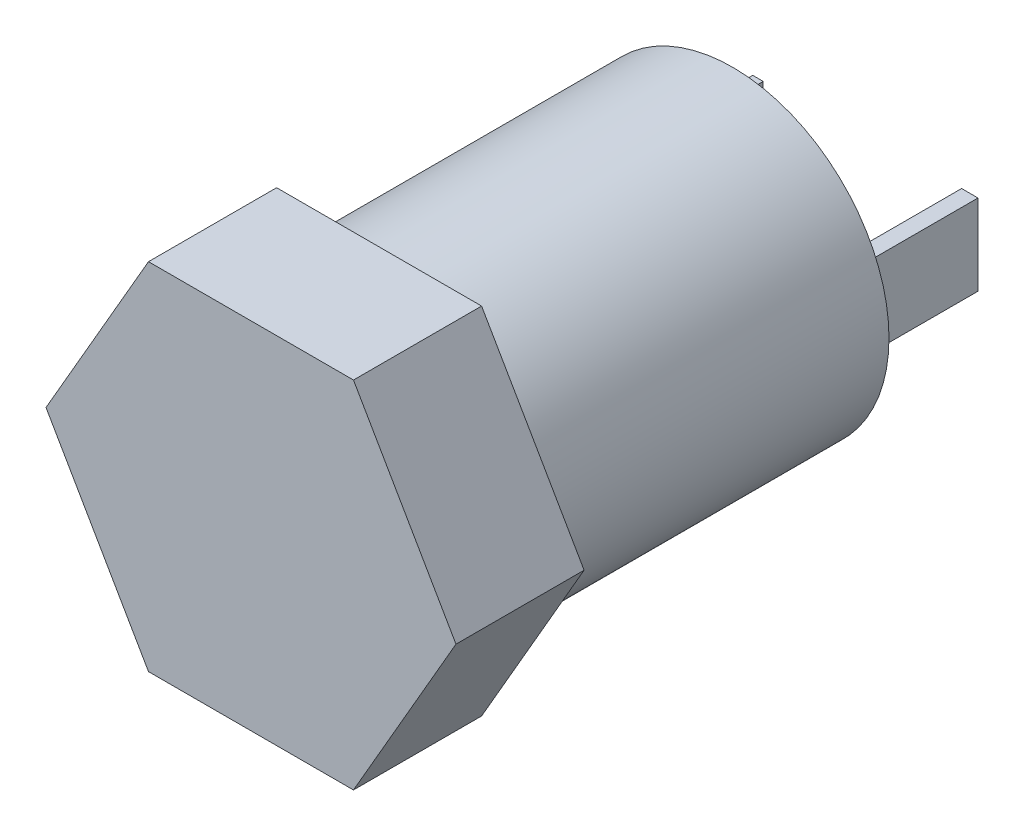
ISO-10303-21;
HEADER;
FILE_DESCRIPTION(('STEP AP214'),'2;1');
FILE_NAME('part.step','',(''),(''),'','','');
FILE_SCHEMA(('AUTOMOTIVE_DESIGN { 1 0 10303 214 1 1 1 1 }'));
ENDSEC;
DATA;
#1=APPLICATION_CONTEXT('core data for automotive mechanical design processes');
#2=APPLICATION_PROTOCOL_DEFINITION('international standard','automotive_design',2000,#1);
#3=PRODUCT_CONTEXT('',#1,'mechanical');
#4=PRODUCT('Part','Part','',(#3));
#5=PRODUCT_RELATED_PRODUCT_CATEGORY('part','',(#4));
#6=PRODUCT_DEFINITION_FORMATION('','',#4);
#7=PRODUCT_DEFINITION_CONTEXT('part definition',#1,'design');
#8=PRODUCT_DEFINITION('design','',#6,#7);
#9=PRODUCT_DEFINITION_SHAPE('','',#8);
#10=(LENGTH_UNIT() NAMED_UNIT(*) SI_UNIT(.MILLI.,.METRE.));
#11=(NAMED_UNIT(*) PLANE_ANGLE_UNIT() SI_UNIT($,.RADIAN.));
#12=(NAMED_UNIT(*) SI_UNIT($,.STERADIAN.) SOLID_ANGLE_UNIT());
#13=UNCERTAINTY_MEASURE_WITH_UNIT(LENGTH_MEASURE(1.E-05),#10,'distance_accuracy_value','');
#14=(GEOMETRIC_REPRESENTATION_CONTEXT(3) GLOBAL_UNCERTAINTY_ASSIGNED_CONTEXT((#13)) GLOBAL_UNIT_ASSIGNED_CONTEXT((#10,
#11,#12)) REPRESENTATION_CONTEXT('',''));
#15=CARTESIAN_POINT('',(0.,0.,0.));
#16=DIRECTION('',(0.,0.,1.));
#17=DIRECTION('',(1.,0.,0.));
#18=AXIS2_PLACEMENT_3D('',#15,#16,#17);
#19=CARTESIAN_POINT('',(0.,0.,-13.8));
#20=DIRECTION('',(0.,0.,-1.));
#21=DIRECTION('',(-1.,0.,0.));
#22=AXIS2_PLACEMENT_3D('',#19,#20,#21);
#23=PLANE('',#22);
#24=CARTESIAN_POINT('',(0.,0.,-13.8));
#25=DIRECTION('',(0.,0.,-1.));
#26=DIRECTION('',(-1.,0.,0.));
#27=AXIS2_PLACEMENT_3D('',#24,#25,#26);
#28=CIRCLE('',#27,6.1);
#29=CARTESIAN_POINT('',(6.1,0.,-13.8));
#30=VERTEX_POINT('',#29);
#31=EDGE_CURVE('E169',#30,#30,#28,.T.);
#32=ORIENTED_EDGE('',*,*,#31,.T.);
#33=EDGE_LOOP('',(#32));
#34=FACE_BOUND('',#33,.T.);
#35=DIRECTION('',(-1.,0.,0.));
#36=VECTOR('',#35,1.);
#37=CARTESIAN_POINT('',(-4.00811270965175,-1.88415554727215,-13.8));
#38=LINE('',#37,#36);
#39=CARTESIAN_POINT('',(-4.00811270965175,-1.88415554727215,-13.8));
#40=VERTEX_POINT('',#39);
#41=CARTESIAN_POINT('',(-4.41920119269296,-1.88415554727215,-13.8));
#42=VERTEX_POINT('',#41);
#43=EDGE_CURVE('E192',#40,#42,#38,.T.);
#44=ORIENTED_EDGE('',*,*,#43,.F.);
#45=DIRECTION('',(0.,-1.,0.));
#46=VECTOR('',#45,1.);
#47=CARTESIAN_POINT('',(-4.00811270965175,1.01630208307413,-13.8));
#48=LINE('',#47,#46);
#49=CARTESIAN_POINT('',(-4.00811270965175,1.01630208307413,-13.8));
#50=VERTEX_POINT('',#49);
#51=EDGE_CURVE('E194',#50,#40,#48,.T.);
#52=ORIENTED_EDGE('',*,*,#51,.F.);
#53=DIRECTION('',(1.,0.,0.));
#54=VECTOR('',#53,1.);
#55=CARTESIAN_POINT('',(-4.00811270965175,1.01630208307413,-13.8));
#56=LINE('',#55,#54);
#57=CARTESIAN_POINT('',(-4.41920119269296,1.01630208307413,-13.8));
#58=VERTEX_POINT('',#57);
#59=EDGE_CURVE('E187',#58,#50,#56,.T.);
#60=ORIENTED_EDGE('',*,*,#59,.F.);
#61=DIRECTION('',(0.,1.,0.));
#62=VECTOR('',#61,1.);
#63=CARTESIAN_POINT('',(-4.41920119269296,1.01630208307413,-13.8));
#64=LINE('',#63,#62);
#65=EDGE_CURVE('E189',#42,#58,#64,.T.);
#66=ORIENTED_EDGE('',*,*,#65,.F.);
#67=EDGE_LOOP('',(#44,#52,#60,#66));
#68=FACE_BOUND('',#67,.T.);
#69=DIRECTION('',(-1.,0.,0.));
#70=VECTOR('',#69,1.);
#71=CARTESIAN_POINT('',(4.37352469457727,-1.88415554727215,-13.8));
#72=LINE('',#71,#70);
#73=CARTESIAN_POINT('',(4.37352469457727,-1.88415554727215,-13.8));
#74=VERTEX_POINT('',#73);
#75=CARTESIAN_POINT('',(3.73405372095762,-1.88415554727215,-13.8));
#76=VERTEX_POINT('',#75);
#77=EDGE_CURVE('E416',#74,#76,#72,.T.);
#78=ORIENTED_EDGE('',*,*,#77,.F.);
#79=DIRECTION('',(0.,-1.,0.));
#80=VECTOR('',#79,1.);
#81=CARTESIAN_POINT('',(4.37352469457727,1.26752282271043,-13.8));
#82=LINE('',#81,#80);
#83=CARTESIAN_POINT('',(4.37352469457727,1.26752282271043,-13.8));
#84=VERTEX_POINT('',#83);
#85=EDGE_CURVE('E167',#84,#74,#82,.T.);
#86=ORIENTED_EDGE('',*,*,#85,.F.);
#87=DIRECTION('',(1.,0.,0.));
#88=VECTOR('',#87,1.);
#89=CARTESIAN_POINT('',(4.37352469457727,1.26752282271043,-13.8));
#90=LINE('',#89,#88);
#91=CARTESIAN_POINT('',(3.73405372095762,1.26752282271043,-13.8));
#92=VERTEX_POINT('',#91);
#93=EDGE_CURVE('E163',#92,#84,#90,.T.);
#94=ORIENTED_EDGE('',*,*,#93,.F.);
#95=DIRECTION('',(0.,1.,0.));
#96=VECTOR('',#95,1.);
#97=CARTESIAN_POINT('',(3.73405372095762,1.26752282271043,-13.8));
#98=LINE('',#97,#96);
#99=EDGE_CURVE('E413',#76,#92,#98,.T.);
#100=ORIENTED_EDGE('',*,*,#99,.F.);
#101=EDGE_LOOP('',(#78,#86,#94,#100));
#102=FACE_BOUND('',#101,.T.);
#103=ADVANCED_FACE('F41',(#34,#68,#102),#23,.T.);
#104=CARTESIAN_POINT('',(4.00000000000008,-6.92820323027546,5.));
#105=DIRECTION('',(-0.866025403784442,0.499999999999995,0.));
#106=DIRECTION('',(-0.499999999999995,-0.866025403784442,0.));
#107=AXIS2_PLACEMENT_3D('',#104,#105,#106);
#108=PLANE('',#107);
#109=DIRECTION('',(0.499999999999995,0.866025403784441,0.));
#110=VECTOR('',#109,1.);
#111=CARTESIAN_POINT('',(4.00000000000008,-6.92820323027546,0.));
#112=LINE('',#111,#110);
#113=CARTESIAN_POINT('',(4.00000000000008,-6.92820323027546,0.));
#114=VERTEX_POINT('',#113);
#115=CARTESIAN_POINT('',(8.,0.,0.));
#116=VERTEX_POINT('',#115);
#117=EDGE_CURVE('E172',#114,#116,#112,.T.);
#118=ORIENTED_EDGE('',*,*,#117,.T.);
#119=DIRECTION('',(0.,0.,-1.));
#120=VECTOR('',#119,1.);
#121=CARTESIAN_POINT('',(8.,0.,5.));
#122=LINE('',#121,#120);
#123=CARTESIAN_POINT('',(8.,0.,5.));
#124=VERTEX_POINT('',#123);
#125=EDGE_CURVE('E45',#124,#116,#122,.T.);
#126=ORIENTED_EDGE('',*,*,#125,.F.);
#127=DIRECTION('',(0.499999999999995,0.866025403784441,0.));
#128=VECTOR('',#127,1.);
#129=CARTESIAN_POINT('',(4.00000000000008,-6.92820323027546,5.));
#130=LINE('',#129,#128);
#131=CARTESIAN_POINT('',(4.00000000000008,-6.92820323027546,5.));
#132=VERTEX_POINT('',#131);
#133=EDGE_CURVE('E204',#132,#124,#130,.T.);
#134=ORIENTED_EDGE('',*,*,#133,.F.);
#135=DIRECTION('',(0.,0.,-1.));
#136=VECTOR('',#135,1.);
#137=CARTESIAN_POINT('',(4.00000000000008,-6.92820323027546,5.));
#138=LINE('',#137,#136);
#139=EDGE_CURVE('E218',#132,#114,#138,.T.);
#140=ORIENTED_EDGE('',*,*,#139,.T.);
#141=EDGE_LOOP('',(#118,#126,#134,#140));
#142=FACE_BOUND('',#141,.T.);
#143=ADVANCED_FACE('F43',(#142),#108,.F.);
#144=CARTESIAN_POINT('',(8.,0.,5.));
#145=DIRECTION('',(-0.866025403784438,-0.500000000000001,0.));
#146=DIRECTION('',(0.500000000000001,-0.866025403784438,0.));
#147=AXIS2_PLACEMENT_3D('',#144,#145,#146);
#148=PLANE('',#147);
#149=DIRECTION('',(-0.500000000000001,0.866025403784438,0.));
#150=VECTOR('',#149,1.);
#151=CARTESIAN_POINT('',(8.,0.,0.));
#152=LINE('',#151,#150);
#153=CARTESIAN_POINT('',(3.99999999999998,6.92820323027552,0.));
#154=VERTEX_POINT('',#153);
#155=EDGE_CURVE('E221',#116,#154,#152,.T.);
#156=ORIENTED_EDGE('',*,*,#155,.T.);
#157=DIRECTION('',(0.,0.,-1.));
#158=VECTOR('',#157,1.);
#159=CARTESIAN_POINT('',(3.99999999999998,6.92820323027552,5.));
#160=LINE('',#159,#158);
#161=CARTESIAN_POINT('',(3.99999999999998,6.92820323027552,5.));
#162=VERTEX_POINT('',#161);
#163=EDGE_CURVE('E240',#162,#154,#160,.T.);
#164=ORIENTED_EDGE('',*,*,#163,.F.);
#165=DIRECTION('',(-0.500000000000001,0.866025403784438,0.));
#166=VECTOR('',#165,1.);
#167=CARTESIAN_POINT('',(8.,0.,5.));
#168=LINE('',#167,#166);
#169=EDGE_CURVE('E207',#124,#162,#168,.T.);
#170=ORIENTED_EDGE('',*,*,#169,.F.);
#171=ORIENTED_EDGE('',*,*,#125,.T.);
#172=EDGE_LOOP('',(#156,#164,#170,#171));
#173=FACE_BOUND('',#172,.T.);
#174=ADVANCED_FACE('F249',(#173),#148,.F.);
#175=CARTESIAN_POINT('',(3.99999999999998,6.92820323027552,5.));
#176=DIRECTION('',(0.,-1.,0.));
#177=DIRECTION('',(1.,0.,0.));
#178=AXIS2_PLACEMENT_3D('',#175,#176,#177);
#179=PLANE('',#178);
#180=DIRECTION('',(-1.,0.,0.));
#181=VECTOR('',#180,1.);
#182=CARTESIAN_POINT('',(3.99999999999998,6.92820323027552,0.));
#183=LINE('',#182,#181);
#184=CARTESIAN_POINT('',(-4.00000000000003,6.92820323027549,0.));
#185=VERTEX_POINT('',#184);
#186=EDGE_CURVE('E223',#154,#185,#183,.T.);
#187=ORIENTED_EDGE('',*,*,#186,.T.);
#188=DIRECTION('',(0.,0.,-1.));
#189=VECTOR('',#188,1.);
#190=CARTESIAN_POINT('',(-4.00000000000003,6.92820323027549,5.));
#191=LINE('',#190,#189);
#192=CARTESIAN_POINT('',(-4.00000000000003,6.92820323027549,5.));
#193=VERTEX_POINT('',#192);
#194=EDGE_CURVE('E238',#193,#185,#191,.T.);
#195=ORIENTED_EDGE('',*,*,#194,.F.);
#196=DIRECTION('',(-1.,0.,0.));
#197=VECTOR('',#196,1.);
#198=CARTESIAN_POINT('',(3.99999999999998,6.92820323027552,5.));
#199=LINE('',#198,#197);
#200=EDGE_CURVE('E210',#162,#193,#199,.T.);
#201=ORIENTED_EDGE('',*,*,#200,.F.);
#202=ORIENTED_EDGE('',*,*,#163,.T.);
#203=EDGE_LOOP('',(#187,#195,#201,#202));
#204=FACE_BOUND('',#203,.T.);
#205=ADVANCED_FACE('F260',(#204),#179,.F.);
#206=CARTESIAN_POINT('',(-4.00000000000003,6.92820323027549,5.));
#207=DIRECTION('',(0.866025403784442,-0.499999999999995,0.));
#208=DIRECTION('',(0.499999999999995,0.866025403784442,0.));
#209=AXIS2_PLACEMENT_3D('',#206,#207,#208);
#210=PLANE('',#209);
#211=DIRECTION('',(-0.499999999999995,-0.866025403784442,0.));
#212=VECTOR('',#211,1.);
#213=CARTESIAN_POINT('',(-4.00000000000003,6.92820323027549,0.));
#214=LINE('',#213,#212);
#215=CARTESIAN_POINT('',(-8.,0.,0.));
#216=VERTEX_POINT('',#215);
#217=EDGE_CURVE('E225',#185,#216,#214,.T.);
#218=ORIENTED_EDGE('',*,*,#217,.T.);
#219=DIRECTION('',(0.,0.,-1.));
#220=VECTOR('',#219,1.);
#221=CARTESIAN_POINT('',(-8.,0.,5.));
#222=LINE('',#221,#220);
#223=CARTESIAN_POINT('',(-8.,0.,5.));
#224=VERTEX_POINT('',#223);
#225=EDGE_CURVE('E235',#224,#216,#222,.T.);
#226=ORIENTED_EDGE('',*,*,#225,.F.);
#227=DIRECTION('',(-0.499999999999995,-0.866025403784442,0.));
#228=VECTOR('',#227,1.);
#229=CARTESIAN_POINT('',(-4.00000000000003,6.92820323027549,5.));
#230=LINE('',#229,#228);
#231=EDGE_CURVE('E212',#193,#224,#230,.T.);
#232=ORIENTED_EDGE('',*,*,#231,.F.);
#233=ORIENTED_EDGE('',*,*,#194,.T.);
#234=EDGE_LOOP('',(#218,#226,#232,#233));
#235=FACE_BOUND('',#234,.T.);
#236=ADVANCED_FACE('F263',(#235),#210,.F.);
#237=CARTESIAN_POINT('',(-8.,0.,5.));
#238=DIRECTION('',(0.866025403784434,0.500000000000007,0.));
#239=DIRECTION('',(-0.500000000000007,0.866025403784435,0.));
#240=AXIS2_PLACEMENT_3D('',#237,#238,#239);
#241=PLANE('',#240);
#242=DIRECTION('',(0.500000000000007,-0.866025403784435,0.));
#243=VECTOR('',#242,1.);
#244=CARTESIAN_POINT('',(-8.,0.,0.));
#245=LINE('',#244,#243);
#246=CARTESIAN_POINT('',(-3.99999999999994,-6.92820323027555,0.));
#247=VERTEX_POINT('',#246);
#248=EDGE_CURVE('E227',#216,#247,#245,.T.);
#249=ORIENTED_EDGE('',*,*,#248,.T.);
#250=DIRECTION('',(0.,0.,-1.));
#251=VECTOR('',#250,1.);
#252=CARTESIAN_POINT('',(-3.99999999999994,-6.92820323027555,5.));
#253=LINE('',#252,#251);
#254=CARTESIAN_POINT('',(-3.99999999999994,-6.92820323027555,5.));
#255=VERTEX_POINT('',#254);
#256=EDGE_CURVE('E232',#255,#247,#253,.T.);
#257=ORIENTED_EDGE('',*,*,#256,.F.);
#258=DIRECTION('',(0.500000000000007,-0.866025403784435,0.));
#259=VECTOR('',#258,1.);
#260=CARTESIAN_POINT('',(-8.,0.,5.));
#261=LINE('',#260,#259);
#262=EDGE_CURVE('E214',#224,#255,#261,.T.);
#263=ORIENTED_EDGE('',*,*,#262,.F.);
#264=ORIENTED_EDGE('',*,*,#225,.T.);
#265=EDGE_LOOP('',(#249,#257,#263,#264));
#266=FACE_BOUND('',#265,.T.);
#267=ADVANCED_FACE('F273',(#266),#241,.F.);
#268=CARTESIAN_POINT('',(-3.99999999999994,-6.92820323027555,5.));
#269=DIRECTION('',(0.,1.,0.));
#270=DIRECTION('',(-1.,0.,0.));
#271=AXIS2_PLACEMENT_3D('',#268,#269,#270);
#272=PLANE('',#271);
#273=DIRECTION('',(1.,0.,0.));
#274=VECTOR('',#273,1.);
#275=CARTESIAN_POINT('',(-3.99999999999994,-6.92820323027555,0.));
#276=LINE('',#275,#274);
#277=EDGE_CURVE('E208',#247,#114,#276,.T.);
#278=ORIENTED_EDGE('',*,*,#277,.T.);
#279=ORIENTED_EDGE('',*,*,#139,.F.);
#280=DIRECTION('',(1.,0.,0.));
#281=VECTOR('',#280,1.);
#282=CARTESIAN_POINT('',(-3.99999999999994,-6.92820323027555,5.));
#283=LINE('',#282,#281);
#284=EDGE_CURVE('E216',#255,#132,#283,.T.);
#285=ORIENTED_EDGE('',*,*,#284,.F.);
#286=ORIENTED_EDGE('',*,*,#256,.T.);
#287=EDGE_LOOP('',(#278,#279,#285,#286));
#288=FACE_BOUND('',#287,.T.);
#289=ADVANCED_FACE('F271',(#288),#272,.F.);
#290=CARTESIAN_POINT('',(0.,0.,5.));
#291=DIRECTION('',(0.,0.,1.));
#292=DIRECTION('',(1.,0.,0.));
#293=AXIS2_PLACEMENT_3D('',#290,#291,#292);
#294=PLANE('',#293);
#295=ORIENTED_EDGE('',*,*,#133,.T.);
#296=ORIENTED_EDGE('',*,*,#169,.T.);
#297=ORIENTED_EDGE('',*,*,#200,.T.);
#298=ORIENTED_EDGE('',*,*,#231,.T.);
#299=ORIENTED_EDGE('',*,*,#262,.T.);
#300=ORIENTED_EDGE('',*,*,#284,.T.);
#301=EDGE_LOOP('',(#295,#296,#297,#298,#299,#300));
#302=FACE_BOUND('',#301,.T.);
#303=ADVANCED_FACE('F267',(#302),#294,.T.);
#304=CARTESIAN_POINT('',(0.,0.,0.));
#305=DIRECTION('',(0.,0.,1.));
#306=DIRECTION('',(1.,0.,0.));
#307=AXIS2_PLACEMENT_3D('',#304,#305,#306);
#308=PLANE('',#307);
#309=CARTESIAN_POINT('',(0.,0.,0.));
#310=DIRECTION('',(0.,0.,-1.));
#311=DIRECTION('',(-1.,0.,0.));
#312=AXIS2_PLACEMENT_3D('',#309,#310,#311);
#313=CIRCLE('',#312,6.1);
#314=CARTESIAN_POINT('',(6.1,0.,0.));
#315=VERTEX_POINT('',#314);
#316=EDGE_CURVE('E11',#315,#315,#313,.T.);
#317=ORIENTED_EDGE('',*,*,#316,.F.);
#318=EDGE_LOOP('',(#317));
#319=FACE_BOUND('',#318,.T.);
#320=ORIENTED_EDGE('',*,*,#117,.F.);
#321=ORIENTED_EDGE('',*,*,#277,.F.);
#322=ORIENTED_EDGE('',*,*,#248,.F.);
#323=ORIENTED_EDGE('',*,*,#217,.F.);
#324=ORIENTED_EDGE('',*,*,#186,.F.);
#325=ORIENTED_EDGE('',*,*,#155,.F.);
#326=EDGE_LOOP('',(#320,#321,#322,#323,#324,#325));
#327=FACE_BOUND('',#326,.T.);
#328=ADVANCED_FACE('F256',(#319,#327),#308,.F.);
#329=CARTESIAN_POINT('',(0.,0.,-13.8));
#330=DIRECTION('',(0.,0.,1.));
#331=DIRECTION('',(1.,0.,0.));
#332=AXIS2_PLACEMENT_3D('',#329,#330,#331);
#333=CYLINDRICAL_SURFACE('',#332,6.1);
#334=CARTESIAN_POINT('',(6.1,0.,-13.8));
#335=CARTESIAN_POINT('',(6.1,0.,-13.65625));
#336=CARTESIAN_POINT('',(6.1,0.,-13.5125));
#337=CARTESIAN_POINT('',(6.1,0.,-13.225));
#338=CARTESIAN_POINT('',(6.1,0.,-13.08125));
#339=CARTESIAN_POINT('',(6.1,0.,-12.79375));
#340=CARTESIAN_POINT('',(6.1,0.,-12.65));
#341=CARTESIAN_POINT('',(6.1,0.,-12.3625));
#342=CARTESIAN_POINT('',(6.1,0.,-12.21875));
#343=CARTESIAN_POINT('',(6.1,0.,-11.93125));
#344=CARTESIAN_POINT('',(6.1,0.,-11.7875));
#345=CARTESIAN_POINT('',(6.1,0.,-11.5));
#346=CARTESIAN_POINT('',(6.1,0.,-11.35625));
#347=CARTESIAN_POINT('',(6.1,0.,-11.06875));
#348=CARTESIAN_POINT('',(6.1,0.,-10.925));
#349=CARTESIAN_POINT('',(6.1,0.,-10.6375));
#350=CARTESIAN_POINT('',(6.1,0.,-10.49375));
#351=CARTESIAN_POINT('',(6.1,0.,-10.20625));
#352=CARTESIAN_POINT('',(6.1,0.,-10.0625));
#353=CARTESIAN_POINT('',(6.1,0.,-9.775));
#354=CARTESIAN_POINT('',(6.1,0.,-9.63125));
#355=CARTESIAN_POINT('',(6.1,0.,-9.34375));
#356=CARTESIAN_POINT('',(6.1,0.,-9.2));
#357=CARTESIAN_POINT('',(6.1,0.,-8.9125));
#358=CARTESIAN_POINT('',(6.1,0.,-8.76875));
#359=CARTESIAN_POINT('',(6.1,0.,-8.48125));
#360=CARTESIAN_POINT('',(6.1,0.,-8.3375));
#361=CARTESIAN_POINT('',(6.1,0.,-8.05));
#362=CARTESIAN_POINT('',(6.1,0.,-7.90625));
#363=CARTESIAN_POINT('',(6.1,0.,-7.61875));
#364=CARTESIAN_POINT('',(6.1,0.,-7.475));
#365=CARTESIAN_POINT('',(6.1,0.,-7.1875));
#366=CARTESIAN_POINT('',(6.1,0.,-7.04375));
#367=CARTESIAN_POINT('',(6.1,0.,-6.75625));
#368=CARTESIAN_POINT('',(6.1,0.,-6.6125));
#369=CARTESIAN_POINT('',(6.1,0.,-6.325));
#370=CARTESIAN_POINT('',(6.1,0.,-6.18125));
#371=CARTESIAN_POINT('',(6.1,0.,-5.89375));
#372=CARTESIAN_POINT('',(6.1,0.,-5.75));
#373=CARTESIAN_POINT('',(6.1,0.,-5.4625));
#374=CARTESIAN_POINT('',(6.1,0.,-5.31875));
#375=CARTESIAN_POINT('',(6.1,0.,-5.03125));
#376=CARTESIAN_POINT('',(6.1,0.,-4.8875));
#377=CARTESIAN_POINT('',(6.1,0.,-4.6));
#378=CARTESIAN_POINT('',(6.1,0.,-4.45625));
#379=CARTESIAN_POINT('',(6.1,0.,-4.16875));
#380=CARTESIAN_POINT('',(6.1,0.,-4.025));
#381=CARTESIAN_POINT('',(6.1,0.,-3.7375));
#382=CARTESIAN_POINT('',(6.1,0.,-3.59375));
#383=CARTESIAN_POINT('',(6.1,0.,-3.30625));
#384=CARTESIAN_POINT('',(6.1,0.,-3.1625));
#385=CARTESIAN_POINT('',(6.1,0.,-2.875));
#386=CARTESIAN_POINT('',(6.1,0.,-2.73125));
#387=CARTESIAN_POINT('',(6.1,0.,-2.44375));
#388=CARTESIAN_POINT('',(6.1,0.,-2.3));
#389=CARTESIAN_POINT('',(6.1,0.,-2.0125));
#390=CARTESIAN_POINT('',(6.1,0.,-1.86875));
#391=CARTESIAN_POINT('',(6.1,0.,-1.58125));
#392=CARTESIAN_POINT('',(6.1,0.,-1.4375));
#393=CARTESIAN_POINT('',(6.1,0.,-1.15));
#394=CARTESIAN_POINT('',(6.1,0.,-1.00625));
#395=CARTESIAN_POINT('',(6.1,0.,-0.71875));
#396=CARTESIAN_POINT('',(6.1,0.,-0.575));
#397=CARTESIAN_POINT('',(6.1,0.,-0.2875));
#398=CARTESIAN_POINT('',(6.1,0.,-0.14375));
#399=CARTESIAN_POINT('',(6.1,0.,0.));
#400=B_SPLINE_CURVE_WITH_KNOTS('',3,(#334,#335,#336,#337,#338,#339,#340,#341,#342,#343,#344,
#345,#346,#347,#348,#349,#350,#351,#352,#353,#354,#355,#356,#357,#358,#359,#360,#361,#362,#363,
#364,#365,#366,#367,#368,#369,#370,#371,#372,#373,#374,#375,#376,#377,#378,#379,#380,#381,#382,
#383,#384,#385,#386,#387,#388,#389,#390,#391,#392,#393,#394,#395,#396,#397,#398,#399),
.UNSPECIFIED.,.F.,.F.,(4,2,2,2,2,2,2,2,2,2,2,2,2,2,2,2,2,2,2,2,2,2,2,2,2,2,2,2,2,2,2,2,4),(0.,
0.431249999999999,0.862499999999999,1.29375,1.725,2.15625,2.5875,3.01875,3.45,3.88125,4.3125,
4.74375,5.175,5.60625,6.0375,6.46875,6.9,7.33125,7.7625,8.19375,8.625,9.05625,9.4875,9.91875,
10.35,10.78125,11.2125,11.64375,12.075,12.50625,12.9375,13.36875,13.8),.UNSPECIFIED.);
#401=EDGE_CURVE('BSEAM295',#30,#315,#400,.T.);
#402=ORIENTED_EDGE('',*,*,#31,.F.);
#403=ORIENTED_EDGE('',*,*,#316,.T.);
#404=ORIENTED_EDGE('',*,*,#401,.T.);
#405=ORIENTED_EDGE('',*,*,#401,.F.);
#406=EDGE_LOOP('',(#402,#404,#403,#405));
#407=FACE_BOUND('',#406,.T.);
#408=ADVANCED_FACE('F295',(#407),#333,.T.);
#409=CARTESIAN_POINT('',(-4.00811270965175,1.01630208307413,-19.));
#410=DIRECTION('',(-1.,0.,0.));
#411=DIRECTION('',(0.,0.,1.));
#412=AXIS2_PLACEMENT_3D('',#409,#410,#411);
#413=PLANE('',#412);
#414=ORIENTED_EDGE('',*,*,#51,.T.);
#415=DIRECTION('',(0.,0.,1.));
#416=VECTOR('',#415,1.);
#417=CARTESIAN_POINT('',(-4.00811270965175,-1.88415554727215,-19.));
#418=LINE('',#417,#416);
#419=CARTESIAN_POINT('',(-4.00811270965175,-1.88415554727215,-19.));
#420=VERTEX_POINT('',#419);
#421=EDGE_CURVE('E177',#420,#40,#418,.T.);
#422=ORIENTED_EDGE('',*,*,#421,.F.);
#423=DIRECTION('',(0.,-1.,0.));
#424=VECTOR('',#423,1.);
#425=CARTESIAN_POINT('',(-4.00811270965175,1.01630208307413,-19.));
#426=LINE('',#425,#424);
#427=CARTESIAN_POINT('',(-4.00811270965175,1.01630208307413,-19.));
#428=VERTEX_POINT('',#427);
#429=EDGE_CURVE('E190',#428,#420,#426,.T.);
#430=ORIENTED_EDGE('',*,*,#429,.F.);
#431=DIRECTION('',(0.,0.,1.));
#432=VECTOR('',#431,1.);
#433=CARTESIAN_POINT('',(-4.00811270965175,1.01630208307413,-19.));
#434=LINE('',#433,#432);
#435=EDGE_CURVE('E183',#428,#50,#434,.T.);
#436=ORIENTED_EDGE('',*,*,#435,.T.);
#437=EDGE_LOOP('',(#414,#422,#430,#436));
#438=FACE_BOUND('',#437,.T.);
#439=ADVANCED_FACE('F297',(#438),#413,.F.);
#440=CARTESIAN_POINT('',(-4.00811270965175,-1.88415554727215,-19.));
#441=DIRECTION('',(0.,1.,0.));
#442=DIRECTION('',(0.,0.,1.));
#443=AXIS2_PLACEMENT_3D('',#440,#441,#442);
#444=PLANE('',#443);
#445=ORIENTED_EDGE('',*,*,#43,.T.);
#446=DIRECTION('',(0.,0.,1.));
#447=VECTOR('',#446,1.);
#448=CARTESIAN_POINT('',(-4.41920119269296,-1.88415554727215,-19.));
#449=LINE('',#448,#447);
#450=CARTESIAN_POINT('',(-4.41920119269296,-1.88415554727215,-19.));
#451=VERTEX_POINT('',#450);
#452=EDGE_CURVE('E179',#451,#42,#449,.T.);
#453=ORIENTED_EDGE('',*,*,#452,.F.);
#454=DIRECTION('',(-1.,0.,0.));
#455=VECTOR('',#454,1.);
#456=CARTESIAN_POINT('',(-4.00811270965175,-1.88415554727215,-19.));
#457=LINE('',#456,#455);
#458=EDGE_CURVE('E200',#420,#451,#457,.T.);
#459=ORIENTED_EDGE('',*,*,#458,.F.);
#460=ORIENTED_EDGE('',*,*,#421,.T.);
#461=EDGE_LOOP('',(#445,#453,#459,#460));
#462=FACE_BOUND('',#461,.T.);
#463=ADVANCED_FACE('F327',(#462),#444,.F.);
#464=CARTESIAN_POINT('',(-4.41920119269296,1.01630208307413,-19.));
#465=DIRECTION('',(1.,0.,0.));
#466=DIRECTION('',(0.,0.,-1.));
#467=AXIS2_PLACEMENT_3D('',#464,#465,#466);
#468=PLANE('',#467);
#469=ORIENTED_EDGE('',*,*,#65,.T.);
#470=DIRECTION('',(0.,0.,1.));
#471=VECTOR('',#470,1.);
#472=CARTESIAN_POINT('',(-4.41920119269296,1.01630208307413,-19.));
#473=LINE('',#472,#471);
#474=CARTESIAN_POINT('',(-4.41920119269296,1.01630208307413,-19.));
#475=VERTEX_POINT('',#474);
#476=EDGE_CURVE('E65',#475,#58,#473,.T.);
#477=ORIENTED_EDGE('',*,*,#476,.F.);
#478=DIRECTION('',(0.,1.,0.));
#479=VECTOR('',#478,1.);
#480=CARTESIAN_POINT('',(-4.41920119269296,1.01630208307413,-19.));
#481=LINE('',#480,#479);
#482=EDGE_CURVE('E198',#451,#475,#481,.T.);
#483=ORIENTED_EDGE('',*,*,#482,.F.);
#484=ORIENTED_EDGE('',*,*,#452,.T.);
#485=EDGE_LOOP('',(#469,#477,#483,#484));
#486=FACE_BOUND('',#485,.T.);
#487=ADVANCED_FACE('F337',(#486),#468,.F.);
#488=CARTESIAN_POINT('',(-4.00811270965175,1.01630208307413,-19.));
#489=DIRECTION('',(0.,-1.,0.));
#490=DIRECTION('',(0.,0.,-1.));
#491=AXIS2_PLACEMENT_3D('',#488,#489,#490);
#492=PLANE('',#491);
#493=ORIENTED_EDGE('',*,*,#59,.T.);
#494=ORIENTED_EDGE('',*,*,#435,.F.);
#495=DIRECTION('',(1.,0.,0.));
#496=VECTOR('',#495,1.);
#497=CARTESIAN_POINT('',(-4.00811270965175,1.01630208307413,-19.));
#498=LINE('',#497,#496);
#499=EDGE_CURVE('E186',#475,#428,#498,.T.);
#500=ORIENTED_EDGE('',*,*,#499,.F.);
#501=ORIENTED_EDGE('',*,*,#476,.T.);
#502=EDGE_LOOP('',(#493,#494,#500,#501));
#503=FACE_BOUND('',#502,.T.);
#504=ADVANCED_FACE('F347',(#503),#492,.F.);
#505=CARTESIAN_POINT('',(0.,0.,-19.));
#506=DIRECTION('',(0.,0.,-1.));
#507=DIRECTION('',(-1.,0.,0.));
#508=AXIS2_PLACEMENT_3D('',#505,#506,#507);
#509=PLANE('',#508);
#510=ORIENTED_EDGE('',*,*,#429,.T.);
#511=ORIENTED_EDGE('',*,*,#458,.T.);
#512=ORIENTED_EDGE('',*,*,#482,.T.);
#513=ORIENTED_EDGE('',*,*,#499,.T.);
#514=EDGE_LOOP('',(#510,#511,#512,#513));
#515=FACE_BOUND('',#514,.T.);
#516=ADVANCED_FACE('F293',(#515),#509,.T.);
#517=CARTESIAN_POINT('',(4.37352469457727,1.26752282271043,-19.));
#518=DIRECTION('',(-1.,0.,0.));
#519=DIRECTION('',(0.,0.,1.));
#520=AXIS2_PLACEMENT_3D('',#517,#518,#519);
#521=PLANE('',#520);
#522=ORIENTED_EDGE('',*,*,#85,.T.);
#523=DIRECTION('',(0.,0.,1.));
#524=VECTOR('',#523,1.);
#525=CARTESIAN_POINT('',(4.37352469457727,-1.88415554727215,-19.));
#526=LINE('',#525,#524);
#527=CARTESIAN_POINT('',(4.37352469457727,-1.88415554727215,-19.));
#528=VERTEX_POINT('',#527);
#529=EDGE_CURVE('E148',#528,#74,#526,.T.);
#530=ORIENTED_EDGE('',*,*,#529,.F.);
#531=DIRECTION('',(0.,-1.,0.));
#532=VECTOR('',#531,1.);
#533=CARTESIAN_POINT('',(4.37352469457727,1.26752282271043,-19.));
#534=LINE('',#533,#532);
#535=CARTESIAN_POINT('',(4.37352469457727,1.26752282271043,-19.));
#536=VERTEX_POINT('',#535);
#537=EDGE_CURVE('E155',#536,#528,#534,.T.);
#538=ORIENTED_EDGE('',*,*,#537,.F.);
#539=DIRECTION('',(0.,0.,1.));
#540=VECTOR('',#539,1.);
#541=CARTESIAN_POINT('',(4.37352469457727,1.26752282271043,-19.));
#542=LINE('',#541,#540);
#543=EDGE_CURVE('E410',#536,#84,#542,.T.);
#544=ORIENTED_EDGE('',*,*,#543,.T.);
#545=EDGE_LOOP('',(#522,#530,#538,#544));
#546=FACE_BOUND('',#545,.T.);
#547=ADVANCED_FACE('F165',(#546),#521,.F.);
#548=CARTESIAN_POINT('',(4.37352469457727,-1.88415554727215,-19.));
#549=DIRECTION('',(0.,1.,0.));
#550=DIRECTION('',(0.,0.,1.));
#551=AXIS2_PLACEMENT_3D('',#548,#549,#550);
#552=PLANE('',#551);
#553=ORIENTED_EDGE('',*,*,#77,.T.);
#554=DIRECTION('',(0.,0.,1.));
#555=VECTOR('',#554,1.);
#556=CARTESIAN_POINT('',(3.73405372095762,-1.88415554727215,-19.));
#557=LINE('',#556,#555);
#558=CARTESIAN_POINT('',(3.73405372095762,-1.88415554727215,-19.));
#559=VERTEX_POINT('',#558);
#560=EDGE_CURVE('E151',#559,#76,#557,.T.);
#561=ORIENTED_EDGE('',*,*,#560,.F.);
#562=DIRECTION('',(-1.,0.,0.));
#563=VECTOR('',#562,1.);
#564=CARTESIAN_POINT('',(4.37352469457727,-1.88415554727215,-19.));
#565=LINE('',#564,#563);
#566=EDGE_CURVE('E144',#528,#559,#565,.T.);
#567=ORIENTED_EDGE('',*,*,#566,.F.);
#568=ORIENTED_EDGE('',*,*,#529,.T.);
#569=EDGE_LOOP('',(#553,#561,#567,#568));
#570=FACE_BOUND('',#569,.T.);
#571=ADVANCED_FACE('F146',(#570),#552,.F.);
#572=CARTESIAN_POINT('',(3.73405372095762,1.26752282271043,-19.));
#573=DIRECTION('',(1.,0.,0.));
#574=DIRECTION('',(0.,0.,-1.));
#575=AXIS2_PLACEMENT_3D('',#572,#573,#574);
#576=PLANE('',#575);
#577=ORIENTED_EDGE('',*,*,#99,.T.);
#578=DIRECTION('',(0.,0.,1.));
#579=VECTOR('',#578,1.);
#580=CARTESIAN_POINT('',(3.73405372095762,1.26752282271043,-19.));
#581=LINE('',#580,#579);
#582=CARTESIAN_POINT('',(3.73405372095762,1.26752282271043,-19.));
#583=VERTEX_POINT('',#582);
#584=EDGE_CURVE('E57',#583,#92,#581,.T.);
#585=ORIENTED_EDGE('',*,*,#584,.F.);
#586=DIRECTION('',(0.,1.,0.));
#587=VECTOR('',#586,1.);
#588=CARTESIAN_POINT('',(3.73405372095762,1.26752282271043,-19.));
#589=LINE('',#588,#587);
#590=EDGE_CURVE('E154',#559,#583,#589,.T.);
#591=ORIENTED_EDGE('',*,*,#590,.F.);
#592=ORIENTED_EDGE('',*,*,#560,.T.);
#593=EDGE_LOOP('',(#577,#585,#591,#592));
#594=FACE_BOUND('',#593,.T.);
#595=ADVANCED_FACE('F380',(#594),#576,.F.);
#596=CARTESIAN_POINT('',(4.37352469457727,1.26752282271043,-19.));
#597=DIRECTION('',(0.,-1.,0.));
#598=DIRECTION('',(0.,0.,-1.));
#599=AXIS2_PLACEMENT_3D('',#596,#597,#598);
#600=PLANE('',#599);
#601=ORIENTED_EDGE('',*,*,#93,.T.);
#602=ORIENTED_EDGE('',*,*,#543,.F.);
#603=DIRECTION('',(1.,0.,0.));
#604=VECTOR('',#603,1.);
#605=CARTESIAN_POINT('',(4.37352469457727,1.26752282271043,-19.));
#606=LINE('',#605,#604);
#607=EDGE_CURVE('E159',#583,#536,#606,.T.);
#608=ORIENTED_EDGE('',*,*,#607,.F.);
#609=ORIENTED_EDGE('',*,*,#584,.T.);
#610=EDGE_LOOP('',(#601,#602,#608,#609));
#611=FACE_BOUND('',#610,.T.);
#612=ADVANCED_FACE('F389',(#611),#600,.F.);
#613=CARTESIAN_POINT('',(0.,0.,-19.));
#614=DIRECTION('',(0.,0.,-1.));
#615=DIRECTION('',(-1.,0.,0.));
#616=AXIS2_PLACEMENT_3D('',#613,#614,#615);
#617=PLANE('',#616);
#618=ORIENTED_EDGE('',*,*,#537,.T.);
#619=ORIENTED_EDGE('',*,*,#566,.T.);
#620=ORIENTED_EDGE('',*,*,#590,.T.);
#621=ORIENTED_EDGE('',*,*,#607,.T.);
#622=EDGE_LOOP('',(#618,#619,#620,#621));
#623=FACE_BOUND('',#622,.T.);
#624=ADVANCED_FACE('F158',(#623),#617,.T.);
#625=CLOSED_SHELL('',(#103,#143,#174,#205,#236,#267,#289,#303,#328,#408,#439,#463,#487,#504,
#516,#547,#571,#595,#612,#624));
#626=MANIFOLD_SOLID_BREP('B2',#625);
#627=ADVANCED_BREP_SHAPE_REPRESENTATION('',(#18,#626),#14);
#628=SHAPE_DEFINITION_REPRESENTATION(#9,#627);
ENDSEC;
END-ISO-10303-21;
